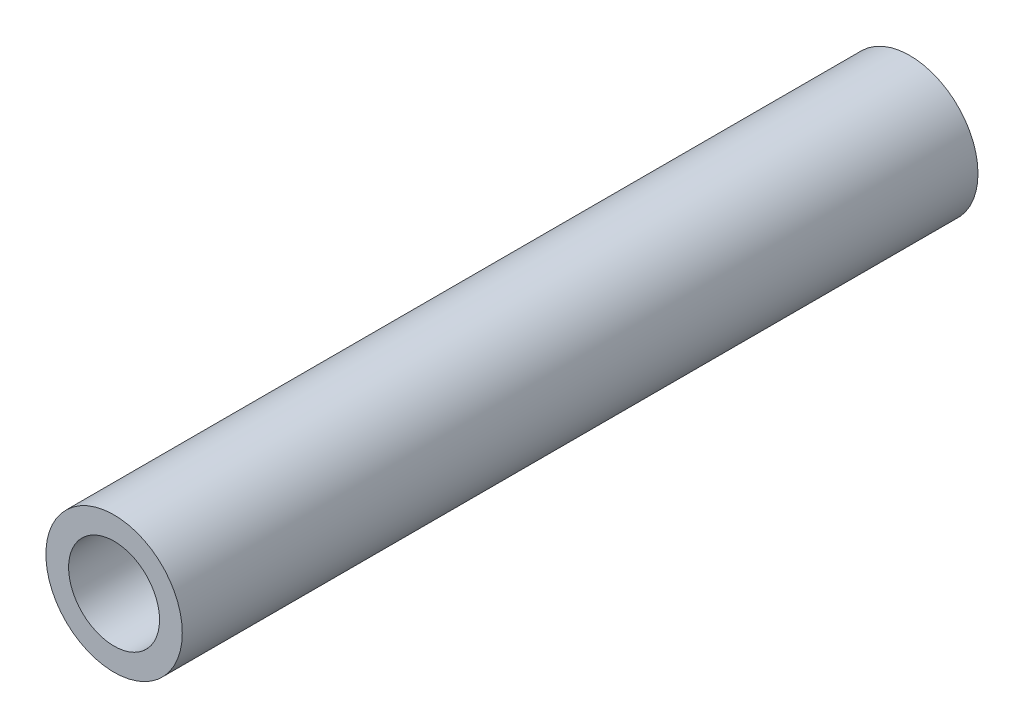
ISO-10303-21;
HEADER;
FILE_DESCRIPTION(('STEP AP214'),'2;1');
FILE_NAME('part.step','',(''),(''),'','','');
FILE_SCHEMA(('AUTOMOTIVE_DESIGN { 1 0 10303 214 1 1 1 1 }'));
ENDSEC;
DATA;
#1=APPLICATION_CONTEXT('core data for automotive mechanical design processes');
#2=APPLICATION_PROTOCOL_DEFINITION('international standard','automotive_design',2000,#1);
#3=PRODUCT_CONTEXT('',#1,'mechanical');
#4=PRODUCT('Part','Part','',(#3));
#5=PRODUCT_RELATED_PRODUCT_CATEGORY('part','',(#4));
#6=PRODUCT_DEFINITION_FORMATION('','',#4);
#7=PRODUCT_DEFINITION_CONTEXT('part definition',#1,'design');
#8=PRODUCT_DEFINITION('design','',#6,#7);
#9=PRODUCT_DEFINITION_SHAPE('','',#8);
#10=(LENGTH_UNIT() NAMED_UNIT(*) SI_UNIT(.MILLI.,.METRE.));
#11=(NAMED_UNIT(*) PLANE_ANGLE_UNIT() SI_UNIT($,.RADIAN.));
#12=(NAMED_UNIT(*) SI_UNIT($,.STERADIAN.) SOLID_ANGLE_UNIT());
#13=UNCERTAINTY_MEASURE_WITH_UNIT(LENGTH_MEASURE(1.E-05),#10,'distance_accuracy_value','');
#14=(GEOMETRIC_REPRESENTATION_CONTEXT(3) GLOBAL_UNCERTAINTY_ASSIGNED_CONTEXT((#13)) GLOBAL_UNIT_ASSIGNED_CONTEXT((#10,
#11,#12)) REPRESENTATION_CONTEXT('',''));
#15=CARTESIAN_POINT('',(0.,0.,0.));
#16=DIRECTION('',(0.,0.,1.));
#17=DIRECTION('',(1.,0.,0.));
#18=AXIS2_PLACEMENT_3D('',#15,#16,#17);
#19=CARTESIAN_POINT('',(0.,0.,35.));
#20=DIRECTION('',(0.,0.,1.));
#21=DIRECTION('',(1.,0.,0.));
#22=AXIS2_PLACEMENT_3D('',#19,#20,#21);
#23=PLANE('',#22);
#24=CARTESIAN_POINT('',(0.,0.,35.));
#25=DIRECTION('',(0.,0.,1.));
#26=DIRECTION('',(1.,0.,0.));
#27=AXIS2_PLACEMENT_3D('',#24,#25,#26);
#28=CIRCLE('',#27,3.);
#29=CARTESIAN_POINT('',(3.,0.,35.));
#30=VERTEX_POINT('',#29);
#31=EDGE_CURVE('E10',#30,#30,#28,.T.);
#32=ORIENTED_EDGE('',*,*,#31,.T.);
#33=EDGE_LOOP('',(#32));
#34=FACE_BOUND('',#33,.T.);
#35=CARTESIAN_POINT('',(0.,0.,35.));
#36=DIRECTION('',(0.,0.,1.));
#37=DIRECTION('',(1.,0.,0.));
#38=AXIS2_PLACEMENT_3D('',#35,#36,#37);
#39=CIRCLE('',#38,2.);
#40=CARTESIAN_POINT('',(2.,0.,35.));
#41=VERTEX_POINT('',#40);
#42=EDGE_CURVE('E41',#41,#41,#39,.T.);
#43=ORIENTED_EDGE('',*,*,#42,.F.);
#44=EDGE_LOOP('',(#43));
#45=FACE_BOUND('',#44,.T.);
#46=ADVANCED_FACE('F30',(#34,#45),#23,.T.);
#47=CARTESIAN_POINT('',(0.,0.,0.));
#48=DIRECTION('',(0.,0.,1.));
#49=DIRECTION('',(1.,0.,0.));
#50=AXIS2_PLACEMENT_3D('',#47,#48,#49);
#51=PLANE('',#50);
#52=CARTESIAN_POINT('',(0.,0.,0.));
#53=DIRECTION('',(0.,0.,1.));
#54=DIRECTION('',(1.,0.,0.));
#55=AXIS2_PLACEMENT_3D('',#52,#53,#54);
#56=CIRCLE('',#55,3.);
#57=CARTESIAN_POINT('',(3.,0.,0.));
#58=VERTEX_POINT('',#57);
#59=EDGE_CURVE('E34',#58,#58,#56,.T.);
#60=ORIENTED_EDGE('',*,*,#59,.F.);
#61=EDGE_LOOP('',(#60));
#62=FACE_BOUND('',#61,.T.);
#63=CARTESIAN_POINT('',(0.,0.,0.));
#64=DIRECTION('',(0.,0.,1.));
#65=DIRECTION('',(1.,0.,0.));
#66=AXIS2_PLACEMENT_3D('',#63,#64,#65);
#67=CIRCLE('',#66,2.);
#68=CARTESIAN_POINT('',(2.,0.,0.));
#69=VERTEX_POINT('',#68);
#70=EDGE_CURVE('E43',#69,#69,#67,.T.);
#71=ORIENTED_EDGE('',*,*,#70,.T.);
#72=EDGE_LOOP('',(#71));
#73=FACE_BOUND('',#72,.T.);
#74=ADVANCED_FACE('F53',(#62,#73),#51,.F.);
#75=CARTESIAN_POINT('',(0.,0.,35.));
#76=DIRECTION('',(0.,0.,-1.));
#77=DIRECTION('',(-1.,0.,0.));
#78=AXIS2_PLACEMENT_3D('',#75,#76,#77);
#79=CYLINDRICAL_SURFACE('',#78,3.);
#80=ORIENTED_EDGE('',*,*,#31,.F.);
#81=EDGE_LOOP('',(#80));
#82=FACE_BOUND('',#81,.T.);
#83=ORIENTED_EDGE('',*,*,#59,.T.);
#84=EDGE_LOOP('',(#83));
#85=FACE_BOUND('',#84,.T.);
#86=ADVANCED_FACE('F32',(#82,#85),#79,.T.);
#87=CARTESIAN_POINT('',(0.,0.,35.));
#88=DIRECTION('',(0.,0.,-1.));
#89=DIRECTION('',(-1.,0.,0.));
#90=AXIS2_PLACEMENT_3D('',#87,#88,#89);
#91=CYLINDRICAL_SURFACE('',#90,2.);
#92=ORIENTED_EDGE('',*,*,#42,.T.);
#93=EDGE_LOOP('',(#92));
#94=FACE_BOUND('',#93,.T.);
#95=ORIENTED_EDGE('',*,*,#70,.F.);
#96=EDGE_LOOP('',(#95));
#97=FACE_BOUND('',#96,.T.);
#98=ADVANCED_FACE('F49',(#94,#97),#91,.F.);
#99=CLOSED_SHELL('',(#46,#74,#86,#98));
#100=MANIFOLD_SOLID_BREP('B2',#99);
#101=ADVANCED_BREP_SHAPE_REPRESENTATION('',(#18,#100),#14);
#102=SHAPE_DEFINITION_REPRESENTATION(#9,#101);
ENDSEC;
END-ISO-10303-21;
